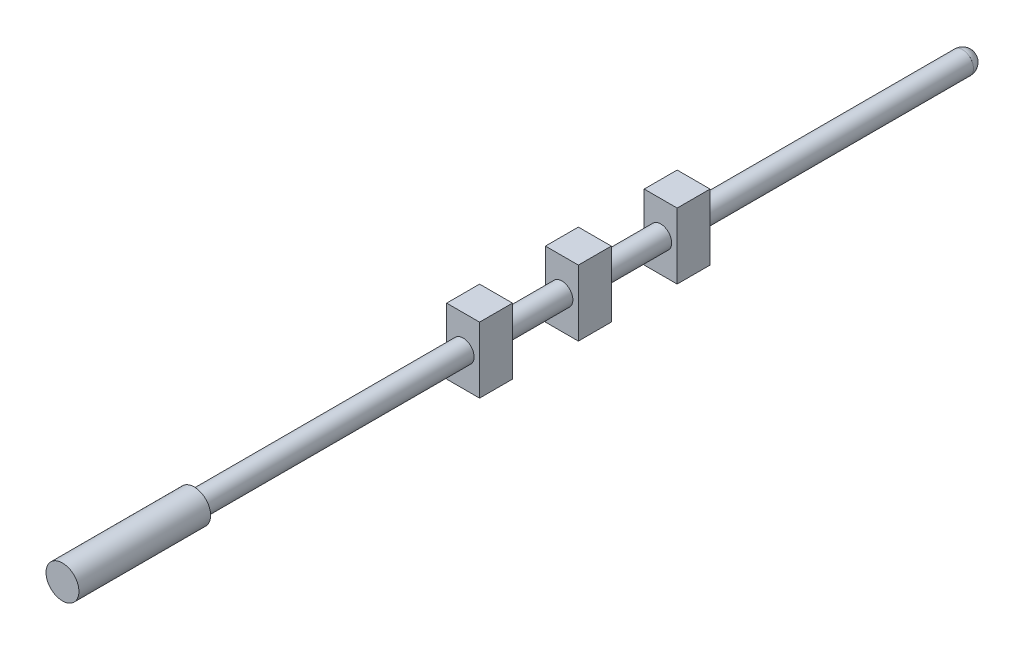
ISO-10303-21;
HEADER;
FILE_DESCRIPTION(('STEP AP214'),'2;1');
FILE_NAME('part.step','',(''),(''),'','','');
FILE_SCHEMA(('AUTOMOTIVE_DESIGN { 1 0 10303 214 1 1 1 1 }'));
ENDSEC;
DATA;
#1=APPLICATION_CONTEXT('core data for automotive mechanical design processes');
#2=APPLICATION_PROTOCOL_DEFINITION('international standard','automotive_design',2000,#1);
#3=PRODUCT_CONTEXT('',#1,'mechanical');
#4=PRODUCT('Part','Part','',(#3));
#5=PRODUCT_RELATED_PRODUCT_CATEGORY('part','',(#4));
#6=PRODUCT_DEFINITION_FORMATION('','',#4);
#7=PRODUCT_DEFINITION_CONTEXT('part definition',#1,'design');
#8=PRODUCT_DEFINITION('design','',#6,#7);
#9=PRODUCT_DEFINITION_SHAPE('','',#8);
#10=(LENGTH_UNIT() NAMED_UNIT(*) SI_UNIT(.MILLI.,.METRE.));
#11=(NAMED_UNIT(*) PLANE_ANGLE_UNIT() SI_UNIT($,.RADIAN.));
#12=(NAMED_UNIT(*) SI_UNIT($,.STERADIAN.) SOLID_ANGLE_UNIT());
#13=UNCERTAINTY_MEASURE_WITH_UNIT(LENGTH_MEASURE(1.E-05),#10,'distance_accuracy_value','');
#14=(GEOMETRIC_REPRESENTATION_CONTEXT(3) GLOBAL_UNCERTAINTY_ASSIGNED_CONTEXT((#13)) GLOBAL_UNIT_ASSIGNED_CONTEXT((#10,
#11,#12)) REPRESENTATION_CONTEXT('',''));
#15=CARTESIAN_POINT('',(0.,0.,0.));
#16=DIRECTION('',(0.,0.,1.));
#17=DIRECTION('',(1.,0.,0.));
#18=AXIS2_PLACEMENT_3D('',#15,#16,#17);
#19=CARTESIAN_POINT('',(0.,0.,0.));
#20=DIRECTION('',(0.,0.,-1.));
#21=DIRECTION('',(-1.,0.,0.));
#22=AXIS2_PLACEMENT_3D('',#19,#20,#21);
#23=PLANE('',#22);
#24=CARTESIAN_POINT('',(0.,0.,0.));
#25=DIRECTION('',(0.,0.,-1.));
#26=DIRECTION('',(-1.,0.,0.));
#27=AXIS2_PLACEMENT_3D('',#24,#25,#26);
#28=CIRCLE('',#27,25.4);
#29=CARTESIAN_POINT('',(-25.4,0.,0.));
#30=VERTEX_POINT('',#29);
#31=EDGE_CURVE('E11',#30,#30,#28,.T.);
#32=ORIENTED_EDGE('',*,*,#31,.F.);
#33=EDGE_LOOP('',(#32));
#34=FACE_BOUND('',#33,.T.);
#35=ADVANCED_FACE('F45',(#34),#23,.F.);
#36=CARTESIAN_POINT('',(0.,0.,0.));
#37=DIRECTION('',(0.,0.,-1.));
#38=DIRECTION('',(-1.,0.,0.));
#39=AXIS2_PLACEMENT_3D('',#36,#37,#38);
#40=SPHERICAL_SURFACE('',#39,25.4);
#41=ORIENTED_EDGE('',*,*,#31,.T.);
#42=EDGE_LOOP('',(#41));
#43=FACE_BOUND('',#42,.T.);
#44=ADVANCED_FACE('F47',(#43),#40,.T.);
#45=CLOSED_SHELL('',(#35,#44));
#46=MANIFOLD_SOLID_BREP('B2',#45);
#47=CARTESIAN_POINT('',(0.,0.,1778.));
#48=DIRECTION('',(0.,0.,-1.));
#49=DIRECTION('',(-1.,0.,0.));
#50=AXIS2_PLACEMENT_3D('',#47,#48,#49);
#51=CYLINDRICAL_SURFACE('',#50,25.4);
#52=CARTESIAN_POINT('',(0.,0.,850.9));
#53=DIRECTION('',(0.,0.,1.));
#54=DIRECTION('',(1.,0.,0.));
#55=AXIS2_PLACEMENT_3D('',#52,#53,#54);
#56=CIRCLE('',#55,25.4);
#57=CARTESIAN_POINT('',(25.4,0.,850.9));
#58=VERTEX_POINT('',#57);
#59=EDGE_CURVE('E272',#58,#58,#56,.T.);
#60=ORIENTED_EDGE('',*,*,#59,.F.);
#61=EDGE_LOOP('',(#60));
#62=FACE_BOUND('',#61,.T.);
#63=CARTESIAN_POINT('',(0.,0.,698.5));
#64=DIRECTION('',(0.,0.,-1.));
#65=DIRECTION('',(-1.,0.,0.));
#66=AXIS2_PLACEMENT_3D('',#63,#64,#65);
#67=CIRCLE('',#66,25.4);
#68=CARTESIAN_POINT('',(-25.4,0.,698.5));
#69=VERTEX_POINT('',#68);
#70=EDGE_CURVE('E43',#69,#69,#67,.T.);
#71=ORIENTED_EDGE('',*,*,#70,.F.);
#72=EDGE_LOOP('',(#71));
#73=FACE_BOUND('',#72,.T.);
#74=ADVANCED_FACE('F75',(#62,#73),#51,.T.);
#75=CARTESIAN_POINT('',(0.,0.,927.1));
#76=DIRECTION('',(0.,0.,-1.));
#77=DIRECTION('',(-1.,0.,0.));
#78=AXIS2_PLACEMENT_3D('',#75,#76,#77);
#79=CIRCLE('',#78,25.4);
#80=CARTESIAN_POINT('',(-25.4,0.,927.1));
#81=VERTEX_POINT('',#80);
#82=EDGE_CURVE('E277',#81,#81,#79,.T.);
#83=ORIENTED_EDGE('',*,*,#82,.F.);
#84=EDGE_LOOP('',(#83));
#85=FACE_BOUND('',#84,.T.);
#86=CARTESIAN_POINT('',(0.,0.,1079.5));
#87=DIRECTION('',(0.,0.,1.));
#88=DIRECTION('',(1.,0.,0.));
#89=AXIS2_PLACEMENT_3D('',#86,#87,#88);
#90=CIRCLE('',#89,25.4);
#91=CARTESIAN_POINT('',(25.4,0.,1079.5));
#92=VERTEX_POINT('',#91);
#93=EDGE_CURVE('E280',#92,#92,#90,.T.);
#94=ORIENTED_EDGE('',*,*,#93,.F.);
#95=EDGE_LOOP('',(#94));
#96=FACE_BOUND('',#95,.T.);
#97=ADVANCED_FACE('F293',(#85,#96),#51,.T.);
#98=CARTESIAN_POINT('',(-38.1,76.2,850.9));
#99=DIRECTION('',(1.,0.,0.));
#100=DIRECTION('',(0.,0.,-1.));
#101=AXIS2_PLACEMENT_3D('',#98,#99,#100);
#102=PLANE('',#101);
#103=DIRECTION('',(0.,0.,1.));
#104=VECTOR('',#103,1.);
#105=CARTESIAN_POINT('',(-38.1,-76.2,850.9));
#106=LINE('',#105,#104);
#107=CARTESIAN_POINT('',(-38.1,-76.2,850.9));
#108=VERTEX_POINT('',#107);
#109=CARTESIAN_POINT('',(-38.1,-76.2,927.1));
#110=VERTEX_POINT('',#109);
#111=EDGE_CURVE('E234',#108,#110,#106,.T.);
#112=ORIENTED_EDGE('',*,*,#111,.T.);
#113=DIRECTION('',(0.,-1.,0.));
#114=VECTOR('',#113,1.);
#115=CARTESIAN_POINT('',(-38.1,76.2,927.1));
#116=LINE('',#115,#114);
#117=CARTESIAN_POINT('',(-38.1,76.2,927.1));
#118=VERTEX_POINT('',#117);
#119=EDGE_CURVE('E260',#118,#110,#116,.T.);
#120=ORIENTED_EDGE('',*,*,#119,.F.);
#121=DIRECTION('',(0.,0.,1.));
#122=VECTOR('',#121,1.);
#123=CARTESIAN_POINT('',(-38.1,76.2,850.9));
#124=LINE('',#123,#122);
#125=CARTESIAN_POINT('',(-38.1,76.2,850.9));
#126=VERTEX_POINT('',#125);
#127=EDGE_CURVE('E242',#126,#118,#124,.T.);
#128=ORIENTED_EDGE('',*,*,#127,.F.);
#129=DIRECTION('',(0.,-1.,0.));
#130=VECTOR('',#129,1.);
#131=CARTESIAN_POINT('',(-38.1,76.2,850.9));
#132=LINE('',#131,#130);
#133=EDGE_CURVE('E248',#126,#108,#132,.T.);
#134=ORIENTED_EDGE('',*,*,#133,.T.);
#135=EDGE_LOOP('',(#112,#120,#128,#134));
#136=FACE_BOUND('',#135,.T.);
#137=ADVANCED_FACE('F299',(#136),#102,.F.);
#138=CARTESIAN_POINT('',(-38.1,76.2,927.1));
#139=DIRECTION('',(0.,0.,-1.));
#140=DIRECTION('',(-1.,0.,0.));
#141=AXIS2_PLACEMENT_3D('',#138,#139,#140);
#142=PLANE('',#141);
#143=ORIENTED_EDGE('',*,*,#82,.T.);
#144=EDGE_LOOP('',(#143));
#145=FACE_BOUND('',#144,.T.);
#146=DIRECTION('',(1.,0.,0.));
#147=VECTOR('',#146,1.);
#148=CARTESIAN_POINT('',(-38.1,-76.2,927.1));
#149=LINE('',#148,#147);
#150=CARTESIAN_POINT('',(38.1,-76.2,927.1));
#151=VERTEX_POINT('',#150);
#152=EDGE_CURVE('E251',#110,#151,#149,.T.);
#153=ORIENTED_EDGE('',*,*,#152,.T.);
#154=DIRECTION('',(0.,-1.,0.));
#155=VECTOR('',#154,1.);
#156=CARTESIAN_POINT('',(38.1,76.2,927.1));
#157=LINE('',#156,#155);
#158=CARTESIAN_POINT('',(38.1,76.2,927.1));
#159=VERTEX_POINT('',#158);
#160=EDGE_CURVE('E258',#159,#151,#157,.T.);
#161=ORIENTED_EDGE('',*,*,#160,.F.);
#162=DIRECTION('',(1.,0.,0.));
#163=VECTOR('',#162,1.);
#164=CARTESIAN_POINT('',(-38.1,76.2,927.1));
#165=LINE('',#164,#163);
#166=EDGE_CURVE('E124',#118,#159,#165,.T.);
#167=ORIENTED_EDGE('',*,*,#166,.F.);
#168=ORIENTED_EDGE('',*,*,#119,.T.);
#169=EDGE_LOOP('',(#153,#161,#167,#168));
#170=FACE_BOUND('',#169,.T.);
#171=ADVANCED_FACE('F372',(#145,#170),#142,.F.);
#172=CARTESIAN_POINT('',(38.1,76.2,850.9));
#173=DIRECTION('',(-1.,0.,0.));
#174=DIRECTION('',(0.,0.,1.));
#175=AXIS2_PLACEMENT_3D('',#172,#173,#174);
#176=PLANE('',#175);
#177=DIRECTION('',(0.,0.,-1.));
#178=VECTOR('',#177,1.);
#179=CARTESIAN_POINT('',(38.1,-76.2,850.9));
#180=LINE('',#179,#178);
#181=CARTESIAN_POINT('',(38.1,-76.2,850.9));
#182=VERTEX_POINT('',#181);
#183=EDGE_CURVE('E110',#151,#182,#180,.T.);
#184=ORIENTED_EDGE('',*,*,#183,.T.);
#185=DIRECTION('',(0.,-1.,0.));
#186=VECTOR('',#185,1.);
#187=CARTESIAN_POINT('',(38.1,76.2,850.9));
#188=LINE('',#187,#186);
#189=CARTESIAN_POINT('',(38.1,76.2,850.9));
#190=VERTEX_POINT('',#189);
#191=EDGE_CURVE('E256',#190,#182,#188,.T.);
#192=ORIENTED_EDGE('',*,*,#191,.F.);
#193=DIRECTION('',(0.,0.,-1.));
#194=VECTOR('',#193,1.);
#195=CARTESIAN_POINT('',(38.1,76.2,850.9));
#196=LINE('',#195,#194);
#197=EDGE_CURVE('E245',#159,#190,#196,.T.);
#198=ORIENTED_EDGE('',*,*,#197,.F.);
#199=ORIENTED_EDGE('',*,*,#160,.T.);
#200=EDGE_LOOP('',(#184,#192,#198,#199));
#201=FACE_BOUND('',#200,.T.);
#202=ADVANCED_FACE('F368',(#201),#176,.F.);
#203=CARTESIAN_POINT('',(-38.1,76.2,850.9));
#204=DIRECTION('',(0.,0.,1.));
#205=DIRECTION('',(1.,0.,0.));
#206=AXIS2_PLACEMENT_3D('',#203,#204,#205);
#207=PLANE('',#206);
#208=ORIENTED_EDGE('',*,*,#59,.T.);
#209=EDGE_LOOP('',(#208));
#210=FACE_BOUND('',#209,.T.);
#211=DIRECTION('',(-1.,0.,0.));
#212=VECTOR('',#211,1.);
#213=CARTESIAN_POINT('',(-38.1,-76.2,850.9));
#214=LINE('',#213,#212);
#215=EDGE_CURVE('E116',#182,#108,#214,.T.);
#216=ORIENTED_EDGE('',*,*,#215,.T.);
#217=ORIENTED_EDGE('',*,*,#133,.F.);
#218=DIRECTION('',(-1.,0.,0.));
#219=VECTOR('',#218,1.);
#220=CARTESIAN_POINT('',(-38.1,76.2,850.9));
#221=LINE('',#220,#219);
#222=EDGE_CURVE('E92',#190,#126,#221,.T.);
#223=ORIENTED_EDGE('',*,*,#222,.F.);
#224=ORIENTED_EDGE('',*,*,#191,.T.);
#225=EDGE_LOOP('',(#216,#217,#223,#224));
#226=FACE_BOUND('',#225,.T.);
#227=ADVANCED_FACE('F362',(#210,#226),#207,.F.);
#228=CARTESIAN_POINT('',(0.,76.2,0.));
#229=DIRECTION('',(0.,1.,0.));
#230=DIRECTION('',(0.,0.,1.));
#231=AXIS2_PLACEMENT_3D('',#228,#229,#230);
#232=PLANE('',#231);
#233=ORIENTED_EDGE('',*,*,#127,.T.);
#234=ORIENTED_EDGE('',*,*,#166,.T.);
#235=ORIENTED_EDGE('',*,*,#197,.T.);
#236=ORIENTED_EDGE('',*,*,#222,.T.);
#237=EDGE_LOOP('',(#233,#234,#235,#236));
#238=FACE_BOUND('',#237,.T.);
#239=ADVANCED_FACE('F358',(#238),#232,.T.);
#240=CARTESIAN_POINT('',(0.,-76.2,0.));
#241=DIRECTION('',(0.,1.,0.));
#242=DIRECTION('',(0.,0.,1.));
#243=AXIS2_PLACEMENT_3D('',#240,#241,#242);
#244=PLANE('',#243);
#245=ORIENTED_EDGE('',*,*,#111,.F.);
#246=ORIENTED_EDGE('',*,*,#215,.F.);
#247=ORIENTED_EDGE('',*,*,#183,.F.);
#248=ORIENTED_EDGE('',*,*,#152,.F.);
#249=EDGE_LOOP('',(#245,#246,#247,#248));
#250=FACE_BOUND('',#249,.T.);
#251=ADVANCED_FACE('F361',(#250),#244,.F.);
#252=CARTESIAN_POINT('',(-38.1,76.2,1079.5));
#253=DIRECTION('',(1.,0.,0.));
#254=DIRECTION('',(0.,0.,-1.));
#255=AXIS2_PLACEMENT_3D('',#252,#253,#254);
#256=PLANE('',#255);
#257=DIRECTION('',(0.,0.,1.));
#258=VECTOR('',#257,1.);
#259=CARTESIAN_POINT('',(-38.1,-76.2,1079.5));
#260=LINE('',#259,#258);
#261=CARTESIAN_POINT('',(-38.1,-76.2,1079.5));
#262=VERTEX_POINT('',#261);
#263=CARTESIAN_POINT('',(-38.1,-76.2,1155.7));
#264=VERTEX_POINT('',#263);
#265=EDGE_CURVE('E231',#262,#264,#260,.T.);
#266=ORIENTED_EDGE('',*,*,#265,.T.);
#267=DIRECTION('',(0.,-1.,0.));
#268=VECTOR('',#267,1.);
#269=CARTESIAN_POINT('',(-38.1,76.2,1155.7));
#270=LINE('',#269,#268);
#271=CARTESIAN_POINT('',(-38.1,76.2,1155.7));
#272=VERTEX_POINT('',#271);
#273=EDGE_CURVE('E201',#272,#264,#270,.T.);
#274=ORIENTED_EDGE('',*,*,#273,.F.);
#275=DIRECTION('',(0.,0.,1.));
#276=VECTOR('',#275,1.);
#277=CARTESIAN_POINT('',(-38.1,76.2,1079.5));
#278=LINE('',#277,#276);
#279=CARTESIAN_POINT('',(-38.1,76.2,1079.5));
#280=VERTEX_POINT('',#279);
#281=EDGE_CURVE('E227',#280,#272,#278,.T.);
#282=ORIENTED_EDGE('',*,*,#281,.F.);
#283=DIRECTION('',(0.,-1.,0.));
#284=VECTOR('',#283,1.);
#285=CARTESIAN_POINT('',(-38.1,76.2,1079.5));
#286=LINE('',#285,#284);
#287=EDGE_CURVE('E220',#280,#262,#286,.T.);
#288=ORIENTED_EDGE('',*,*,#287,.T.);
#289=EDGE_LOOP('',(#266,#274,#282,#288));
#290=FACE_BOUND('',#289,.T.);
#291=ADVANCED_FACE('F327',(#290),#256,.F.);
#292=CARTESIAN_POINT('',(-38.1,76.2,1155.7));
#293=DIRECTION('',(0.,0.,-1.));
#294=DIRECTION('',(-1.,0.,0.));
#295=AXIS2_PLACEMENT_3D('',#292,#293,#294);
#296=PLANE('',#295);
#297=CARTESIAN_POINT('',(0.,0.,1155.7));
#298=DIRECTION('',(0.,0.,-1.));
#299=DIRECTION('',(-1.,0.,0.));
#300=AXIS2_PLACEMENT_3D('',#297,#298,#299);
#301=CIRCLE('',#300,25.4);
#302=CARTESIAN_POINT('',(-25.4,0.,1155.7));
#303=VERTEX_POINT('',#302);
#304=EDGE_CURVE('E283',#303,#303,#301,.T.);
#305=ORIENTED_EDGE('',*,*,#304,.T.);
#306=EDGE_LOOP('',(#305));
#307=FACE_BOUND('',#306,.T.);
#308=DIRECTION('',(1.,0.,0.));
#309=VECTOR('',#308,1.);
#310=CARTESIAN_POINT('',(-38.1,-76.2,1155.7));
#311=LINE('',#310,#309);
#312=CARTESIAN_POINT('',(38.1,-76.2,1155.7));
#313=VERTEX_POINT('',#312);
#314=EDGE_CURVE('E229',#264,#313,#311,.T.);
#315=ORIENTED_EDGE('',*,*,#314,.T.);
#316=DIRECTION('',(0.,-1.,0.));
#317=VECTOR('',#316,1.);
#318=CARTESIAN_POINT('',(38.1,76.2,1155.7));
#319=LINE('',#318,#317);
#320=CARTESIAN_POINT('',(38.1,76.2,1155.7));
#321=VERTEX_POINT('',#320);
#322=EDGE_CURVE('E204',#321,#313,#319,.T.);
#323=ORIENTED_EDGE('',*,*,#322,.F.);
#324=DIRECTION('',(1.,0.,0.));
#325=VECTOR('',#324,1.);
#326=CARTESIAN_POINT('',(-38.1,76.2,1155.7));
#327=LINE('',#326,#325);
#328=EDGE_CURVE('E238',#272,#321,#327,.T.);
#329=ORIENTED_EDGE('',*,*,#328,.F.);
#330=ORIENTED_EDGE('',*,*,#273,.T.);
#331=EDGE_LOOP('',(#315,#323,#329,#330));
#332=FACE_BOUND('',#331,.T.);
#333=ADVANCED_FACE('F323',(#307,#332),#296,.F.);
#334=CARTESIAN_POINT('',(38.1,76.2,1079.5));
#335=DIRECTION('',(-1.,0.,0.));
#336=DIRECTION('',(0.,0.,1.));
#337=AXIS2_PLACEMENT_3D('',#334,#335,#336);
#338=PLANE('',#337);
#339=DIRECTION('',(0.,0.,-1.));
#340=VECTOR('',#339,1.);
#341=CARTESIAN_POINT('',(38.1,-76.2,1079.5));
#342=LINE('',#341,#340);
#343=CARTESIAN_POINT('',(38.1,-76.2,1079.5));
#344=VERTEX_POINT('',#343);
#345=EDGE_CURVE('E226',#313,#344,#342,.T.);
#346=ORIENTED_EDGE('',*,*,#345,.T.);
#347=DIRECTION('',(0.,-1.,0.));
#348=VECTOR('',#347,1.);
#349=CARTESIAN_POINT('',(38.1,76.2,1079.5));
#350=LINE('',#349,#348);
#351=CARTESIAN_POINT('',(38.1,76.2,1079.5));
#352=VERTEX_POINT('',#351);
#353=EDGE_CURVE('E217',#352,#344,#350,.T.);
#354=ORIENTED_EDGE('',*,*,#353,.F.);
#355=DIRECTION('',(0.,0.,-1.));
#356=VECTOR('',#355,1.);
#357=CARTESIAN_POINT('',(38.1,76.2,1079.5));
#358=LINE('',#357,#356);
#359=EDGE_CURVE('E236',#321,#352,#358,.T.);
#360=ORIENTED_EDGE('',*,*,#359,.F.);
#361=ORIENTED_EDGE('',*,*,#322,.T.);
#362=EDGE_LOOP('',(#346,#354,#360,#361));
#363=FACE_BOUND('',#362,.T.);
#364=ADVANCED_FACE('F326',(#363),#338,.F.);
#365=CARTESIAN_POINT('',(-38.1,76.2,1079.5));
#366=DIRECTION('',(0.,0.,1.));
#367=DIRECTION('',(1.,0.,0.));
#368=AXIS2_PLACEMENT_3D('',#365,#366,#367);
#369=PLANE('',#368);
#370=ORIENTED_EDGE('',*,*,#93,.T.);
#371=EDGE_LOOP('',(#370));
#372=FACE_BOUND('',#371,.T.);
#373=DIRECTION('',(-1.,0.,0.));
#374=VECTOR('',#373,1.);
#375=CARTESIAN_POINT('',(-38.1,-76.2,1079.5));
#376=LINE('',#375,#374);
#377=EDGE_CURVE('E224',#344,#262,#376,.T.);
#378=ORIENTED_EDGE('',*,*,#377,.T.);
#379=ORIENTED_EDGE('',*,*,#287,.F.);
#380=DIRECTION('',(-1.,0.,0.));
#381=VECTOR('',#380,1.);
#382=CARTESIAN_POINT('',(-38.1,76.2,1079.5));
#383=LINE('',#382,#381);
#384=EDGE_CURVE('E223',#352,#280,#383,.T.);
#385=ORIENTED_EDGE('',*,*,#384,.F.);
#386=ORIENTED_EDGE('',*,*,#353,.T.);
#387=EDGE_LOOP('',(#378,#379,#385,#386));
#388=FACE_BOUND('',#387,.T.);
#389=ADVANCED_FACE('F341',(#372,#388),#369,.F.);
#390=CARTESIAN_POINT('',(0.,76.2,0.));
#391=DIRECTION('',(0.,1.,0.));
#392=DIRECTION('',(0.,0.,1.));
#393=AXIS2_PLACEMENT_3D('',#390,#391,#392);
#394=PLANE('',#393);
#395=ORIENTED_EDGE('',*,*,#281,.T.);
#396=ORIENTED_EDGE('',*,*,#328,.T.);
#397=ORIENTED_EDGE('',*,*,#359,.T.);
#398=ORIENTED_EDGE('',*,*,#384,.T.);
#399=EDGE_LOOP('',(#395,#396,#397,#398));
#400=FACE_BOUND('',#399,.T.);
#401=ADVANCED_FACE('F346',(#400),#394,.T.);
#402=CARTESIAN_POINT('',(0.,-76.2,0.));
#403=DIRECTION('',(0.,1.,0.));
#404=DIRECTION('',(0.,0.,1.));
#405=AXIS2_PLACEMENT_3D('',#402,#403,#404);
#406=PLANE('',#405);
#407=ORIENTED_EDGE('',*,*,#265,.F.);
#408=ORIENTED_EDGE('',*,*,#377,.F.);
#409=ORIENTED_EDGE('',*,*,#345,.F.);
#410=ORIENTED_EDGE('',*,*,#314,.F.);
#411=EDGE_LOOP('',(#407,#408,#409,#410));
#412=FACE_BOUND('',#411,.T.);
#413=ADVANCED_FACE('F338',(#412),#406,.F.);
#414=CARTESIAN_POINT('',(0.,0.,2082.8));
#415=DIRECTION('',(0.,0.,1.));
#416=DIRECTION('',(1.,0.,0.));
#417=AXIS2_PLACEMENT_3D('',#414,#415,#416);
#418=PLANE('',#417);
#419=CARTESIAN_POINT('',(0.,0.,2082.8));
#420=DIRECTION('',(0.,0.,1.));
#421=DIRECTION('',(1.,0.,0.));
#422=AXIS2_PLACEMENT_3D('',#419,#420,#421);
#423=CIRCLE('',#422,38.1);
#424=CARTESIAN_POINT('',(-38.1,0.,2082.8));
#425=VERTEX_POINT('',#424);
#426=EDGE_CURVE('E263',#425,#425,#423,.T.);
#427=ORIENTED_EDGE('',*,*,#426,.T.);
#428=EDGE_LOOP('',(#427));
#429=FACE_BOUND('',#428,.T.);
#430=ADVANCED_FACE('F353',(#429),#418,.T.);
#431=CARTESIAN_POINT('',(0.,0.,2082.8));
#432=DIRECTION('',(0.,0.,-1.));
#433=DIRECTION('',(-1.,0.,0.));
#434=AXIS2_PLACEMENT_3D('',#431,#432,#433);
#435=CYLINDRICAL_SURFACE('',#434,38.1);
#436=CARTESIAN_POINT('',(0.,0.,1778.));
#437=DIRECTION('',(0.,0.,1.));
#438=DIRECTION('',(1.,0.,0.));
#439=AXIS2_PLACEMENT_3D('',#436,#437,#438);
#440=CIRCLE('',#439,38.1);
#441=CARTESIAN_POINT('',(-38.1,0.,1778.));
#442=VERTEX_POINT('',#441);
#443=EDGE_CURVE('E262',#442,#442,#440,.T.);
#444=CARTESIAN_POINT('',(-38.1,0.,2082.8));
#445=CARTESIAN_POINT('',(-38.1,0.,2079.625));
#446=CARTESIAN_POINT('',(-38.1,0.,2076.45));
#447=CARTESIAN_POINT('',(-38.1,0.,2070.1));
#448=CARTESIAN_POINT('',(-38.1,0.,2066.925));
#449=CARTESIAN_POINT('',(-38.1,0.,2060.575));
#450=CARTESIAN_POINT('',(-38.1,0.,2057.4));
#451=CARTESIAN_POINT('',(-38.1,0.,2051.05));
#452=CARTESIAN_POINT('',(-38.1,0.,2047.875));
#453=CARTESIAN_POINT('',(-38.1,0.,2041.525));
#454=CARTESIAN_POINT('',(-38.1,0.,2038.35));
#455=CARTESIAN_POINT('',(-38.1,0.,2032.));
#456=CARTESIAN_POINT('',(-38.1,0.,2028.825));
#457=CARTESIAN_POINT('',(-38.1,0.,2022.475));
#458=CARTESIAN_POINT('',(-38.1,0.,2019.3));
#459=CARTESIAN_POINT('',(-38.1,0.,2012.95));
#460=CARTESIAN_POINT('',(-38.1,0.,2009.775));
#461=CARTESIAN_POINT('',(-38.1,0.,2003.425));
#462=CARTESIAN_POINT('',(-38.1,0.,2000.25));
#463=CARTESIAN_POINT('',(-38.1,0.,1993.9));
#464=CARTESIAN_POINT('',(-38.1,0.,1990.725));
#465=CARTESIAN_POINT('',(-38.1,0.,1984.375));
#466=CARTESIAN_POINT('',(-38.1,0.,1981.2));
#467=CARTESIAN_POINT('',(-38.1,0.,1974.85));
#468=CARTESIAN_POINT('',(-38.1,0.,1971.675));
#469=CARTESIAN_POINT('',(-38.1,0.,1965.325));
#470=CARTESIAN_POINT('',(-38.1,0.,1962.15));
#471=CARTESIAN_POINT('',(-38.1,0.,1955.8));
#472=CARTESIAN_POINT('',(-38.1,0.,1952.625));
#473=CARTESIAN_POINT('',(-38.1,0.,1946.275));
#474=CARTESIAN_POINT('',(-38.1,0.,1943.1));
#475=CARTESIAN_POINT('',(-38.1,0.,1936.75));
#476=CARTESIAN_POINT('',(-38.1,0.,1933.575));
#477=CARTESIAN_POINT('',(-38.1,0.,1927.225));
#478=CARTESIAN_POINT('',(-38.1,0.,1924.05));
#479=CARTESIAN_POINT('',(-38.1,0.,1917.7));
#480=CARTESIAN_POINT('',(-38.1,0.,1914.525));
#481=CARTESIAN_POINT('',(-38.1,0.,1908.175));
#482=CARTESIAN_POINT('',(-38.1,0.,1905.));
#483=CARTESIAN_POINT('',(-38.1,0.,1898.65));
#484=CARTESIAN_POINT('',(-38.1,0.,1895.475));
#485=CARTESIAN_POINT('',(-38.1,0.,1889.125));
#486=CARTESIAN_POINT('',(-38.1,0.,1885.95));
#487=CARTESIAN_POINT('',(-38.1,0.,1879.6));
#488=CARTESIAN_POINT('',(-38.1,0.,1876.425));
#489=CARTESIAN_POINT('',(-38.1,0.,1870.075));
#490=CARTESIAN_POINT('',(-38.1,0.,1866.9));
#491=CARTESIAN_POINT('',(-38.1,0.,1860.55));
#492=CARTESIAN_POINT('',(-38.1,0.,1857.375));
#493=CARTESIAN_POINT('',(-38.1,0.,1851.025));
#494=CARTESIAN_POINT('',(-38.1,0.,1847.85));
#495=CARTESIAN_POINT('',(-38.1,0.,1841.5));
#496=CARTESIAN_POINT('',(-38.1,0.,1838.325));
#497=CARTESIAN_POINT('',(-38.1,0.,1831.975));
#498=CARTESIAN_POINT('',(-38.1,0.,1828.8));
#499=CARTESIAN_POINT('',(-38.1,0.,1822.45));
#500=CARTESIAN_POINT('',(-38.1,0.,1819.275));
#501=CARTESIAN_POINT('',(-38.1,0.,1812.925));
#502=CARTESIAN_POINT('',(-38.1,0.,1809.75));
#503=CARTESIAN_POINT('',(-38.1,0.,1803.4));
#504=CARTESIAN_POINT('',(-38.1,0.,1800.225));
#505=CARTESIAN_POINT('',(-38.1,0.,1793.875));
#506=CARTESIAN_POINT('',(-38.1,0.,1790.7));
#507=CARTESIAN_POINT('',(-38.1,0.,1784.35));
#508=CARTESIAN_POINT('',(-38.1,0.,1781.175));
#509=CARTESIAN_POINT('',(-38.1,0.,1778.));
#510=B_SPLINE_CURVE_WITH_KNOTS('',3,(#444,#445,#446,#447,#448,#449,#450,#451,#452,#453,#454,
#455,#456,#457,#458,#459,#460,#461,#462,#463,#464,#465,#466,#467,#468,#469,#470,#471,#472,#473,
#474,#475,#476,#477,#478,#479,#480,#481,#482,#483,#484,#485,#486,#487,#488,#489,#490,#491,#492,
#493,#494,#495,#496,#497,#498,#499,#500,#501,#502,#503,#504,#505,#506,#507,#508,#509),
.UNSPECIFIED.,.F.,.F.,(4,2,2,2,2,2,2,2,2,2,2,2,2,2,2,2,2,2,2,2,2,2,2,2,2,2,2,2,2,2,2,2,4),(0.,
9.52500000000001,19.05,28.575,38.1,47.625,57.15,66.675,76.2,85.7250000000003,95.2500000000003,
104.775,114.3,123.825,133.35,142.875,152.4,161.925,171.45,180.975,190.5,200.025,209.55,219.075,
228.6,238.125,247.65,257.175,266.7,276.225,285.75,295.275,304.8),.UNSPECIFIED.);
#511=EDGE_CURVE('BSEAM316',#425,#442,#510,.T.);
#512=ORIENTED_EDGE('',*,*,#426,.F.);
#513=ORIENTED_EDGE('',*,*,#443,.T.);
#514=ORIENTED_EDGE('',*,*,#511,.T.);
#515=ORIENTED_EDGE('',*,*,#511,.F.);
#516=EDGE_LOOP('',(#512,#514,#513,#515));
#517=FACE_BOUND('',#516,.T.);
#518=ADVANCED_FACE('F316',(#517),#435,.T.);
#519=CARTESIAN_POINT('',(0.,0.,1778.));
#520=DIRECTION('',(0.,0.,1.));
#521=DIRECTION('',(1.,0.,0.));
#522=AXIS2_PLACEMENT_3D('',#519,#520,#521);
#523=PLANE('',#522);
#524=CARTESIAN_POINT('',(0.,0.,1778.));
#525=DIRECTION('',(0.,0.,1.));
#526=DIRECTION('',(1.,0.,0.));
#527=AXIS2_PLACEMENT_3D('',#524,#525,#526);
#528=CIRCLE('',#527,25.4);
#529=CARTESIAN_POINT('',(25.4,0.,1778.));
#530=VERTEX_POINT('',#529);
#531=EDGE_CURVE('E269',#530,#530,#528,.T.);
#532=ORIENTED_EDGE('',*,*,#531,.T.);
#533=EDGE_LOOP('',(#532));
#534=FACE_BOUND('',#533,.T.);
#535=ORIENTED_EDGE('',*,*,#443,.F.);
#536=EDGE_LOOP('',(#535));
#537=FACE_BOUND('',#536,.T.);
#538=ADVANCED_FACE('F308',(#534,#537),#523,.F.);
#539=ORIENTED_EDGE('',*,*,#531,.F.);
#540=EDGE_LOOP('',(#539));
#541=FACE_BOUND('',#540,.T.);
#542=ORIENTED_EDGE('',*,*,#304,.F.);
#543=EDGE_LOOP('',(#542));
#544=FACE_BOUND('',#543,.T.);
#545=ADVANCED_FACE('F77',(#541,#544),#51,.T.);
#546=CARTESIAN_POINT('',(-38.1,76.2,622.3));
#547=DIRECTION('',(1.,0.,0.));
#548=DIRECTION('',(0.,0.,-1.));
#549=AXIS2_PLACEMENT_3D('',#546,#547,#548);
#550=PLANE('',#549);
#551=DIRECTION('',(0.,0.,1.));
#552=VECTOR('',#551,1.);
#553=CARTESIAN_POINT('',(-38.1,-76.2,622.3));
#554=LINE('',#553,#552);
#555=CARTESIAN_POINT('',(-38.1,-76.2,622.3));
#556=VERTEX_POINT('',#555);
#557=CARTESIAN_POINT('',(-38.1,-76.2,698.5));
#558=VERTEX_POINT('',#557);
#559=EDGE_CURVE('E194',#556,#558,#554,.T.);
#560=ORIENTED_EDGE('',*,*,#559,.T.);
#561=DIRECTION('',(0.,-1.,0.));
#562=VECTOR('',#561,1.);
#563=CARTESIAN_POINT('',(-38.1,76.2,698.5));
#564=LINE('',#563,#562);
#565=CARTESIAN_POINT('',(-38.1,76.2,698.5));
#566=VERTEX_POINT('',#565);
#567=EDGE_CURVE('E608',#566,#558,#564,.T.);
#568=ORIENTED_EDGE('',*,*,#567,.F.);
#569=DIRECTION('',(0.,0.,1.));
#570=VECTOR('',#569,1.);
#571=CARTESIAN_POINT('',(-38.1,76.2,622.3));
#572=LINE('',#571,#570);
#573=CARTESIAN_POINT('',(-38.1,76.2,622.3));
#574=VERTEX_POINT('',#573);
#575=EDGE_CURVE('E188',#574,#566,#572,.T.);
#576=ORIENTED_EDGE('',*,*,#575,.F.);
#577=DIRECTION('',(0.,-1.,0.));
#578=VECTOR('',#577,1.);
#579=CARTESIAN_POINT('',(-38.1,76.2,622.3));
#580=LINE('',#579,#578);
#581=EDGE_CURVE('E180',#574,#556,#580,.T.);
#582=ORIENTED_EDGE('',*,*,#581,.T.);
#583=EDGE_LOOP('',(#560,#568,#576,#582));
#584=FACE_BOUND('',#583,.T.);
#585=ADVANCED_FACE('F192',(#584),#550,.F.);
#586=CARTESIAN_POINT('',(-38.1,76.2,698.5));
#587=DIRECTION('',(0.,0.,-1.));
#588=DIRECTION('',(-1.,0.,0.));
#589=AXIS2_PLACEMENT_3D('',#586,#587,#588);
#590=PLANE('',#589);
#591=ORIENTED_EDGE('',*,*,#70,.T.);
#592=EDGE_LOOP('',(#591));
#593=FACE_BOUND('',#592,.T.);
#594=DIRECTION('',(1.,0.,0.));
#595=VECTOR('',#594,1.);
#596=CARTESIAN_POINT('',(-38.1,-76.2,698.5));
#597=LINE('',#596,#595);
#598=CARTESIAN_POINT('',(38.1,-76.2,698.5));
#599=VERTEX_POINT('',#598);
#600=EDGE_CURVE('E199',#558,#599,#597,.T.);
#601=ORIENTED_EDGE('',*,*,#600,.T.);
#602=DIRECTION('',(0.,-1.,0.));
#603=VECTOR('',#602,1.);
#604=CARTESIAN_POINT('',(38.1,76.2,698.5));
#605=LINE('',#604,#603);
#606=CARTESIAN_POINT('',(38.1,76.2,698.5));
#607=VERTEX_POINT('',#606);
#608=EDGE_CURVE('E610',#607,#599,#605,.T.);
#609=ORIENTED_EDGE('',*,*,#608,.F.);
#610=DIRECTION('',(1.,0.,0.));
#611=VECTOR('',#610,1.);
#612=CARTESIAN_POINT('',(-38.1,76.2,698.5));
#613=LINE('',#612,#611);
#614=EDGE_CURVE('E212',#566,#607,#613,.T.);
#615=ORIENTED_EDGE('',*,*,#614,.F.);
#616=ORIENTED_EDGE('',*,*,#567,.T.);
#617=EDGE_LOOP('',(#601,#609,#615,#616));
#618=FACE_BOUND('',#617,.T.);
#619=ADVANCED_FACE('F314',(#593,#618),#590,.F.);
#620=CARTESIAN_POINT('',(38.1,76.2,622.3));
#621=DIRECTION('',(-1.,0.,0.));
#622=DIRECTION('',(0.,0.,1.));
#623=AXIS2_PLACEMENT_3D('',#620,#621,#622);
#624=PLANE('',#623);
#625=DIRECTION('',(0.,0.,-1.));
#626=VECTOR('',#625,1.);
#627=CARTESIAN_POINT('',(38.1,-76.2,622.3));
#628=LINE('',#627,#626);
#629=CARTESIAN_POINT('',(38.1,-76.2,622.3));
#630=VERTEX_POINT('',#629);
#631=EDGE_CURVE('E187',#599,#630,#628,.T.);
#632=ORIENTED_EDGE('',*,*,#631,.T.);
#633=DIRECTION('',(0.,-1.,0.));
#634=VECTOR('',#633,1.);
#635=CARTESIAN_POINT('',(38.1,76.2,622.3));
#636=LINE('',#635,#634);
#637=CARTESIAN_POINT('',(38.1,76.2,622.3));
#638=VERTEX_POINT('',#637);
#639=EDGE_CURVE('E183',#638,#630,#636,.T.);
#640=ORIENTED_EDGE('',*,*,#639,.F.);
#641=DIRECTION('',(0.,0.,-1.));
#642=VECTOR('',#641,1.);
#643=CARTESIAN_POINT('',(38.1,76.2,622.3));
#644=LINE('',#643,#642);
#645=EDGE_CURVE('E210',#607,#638,#644,.T.);
#646=ORIENTED_EDGE('',*,*,#645,.F.);
#647=ORIENTED_EDGE('',*,*,#608,.T.);
#648=EDGE_LOOP('',(#632,#640,#646,#647));
#649=FACE_BOUND('',#648,.T.);
#650=ADVANCED_FACE('F520',(#649),#624,.F.);
#651=CARTESIAN_POINT('',(-38.1,76.2,622.3));
#652=DIRECTION('',(0.,0.,1.));
#653=DIRECTION('',(1.,0.,0.));
#654=AXIS2_PLACEMENT_3D('',#651,#652,#653);
#655=PLANE('',#654);
#656=CARTESIAN_POINT('',(0.,0.,622.3));
#657=DIRECTION('',(0.,0.,1.));
#658=DIRECTION('',(1.,0.,0.));
#659=AXIS2_PLACEMENT_3D('',#656,#657,#658);
#660=CIRCLE('',#659,25.4);
#661=CARTESIAN_POINT('',(25.4,0.,622.3));
#662=VERTEX_POINT('',#661);
#663=EDGE_CURVE('E84',#662,#662,#660,.T.);
#664=ORIENTED_EDGE('',*,*,#663,.T.);
#665=EDGE_LOOP('',(#664));
#666=FACE_BOUND('',#665,.T.);
#667=DIRECTION('',(-1.,0.,0.));
#668=VECTOR('',#667,1.);
#669=CARTESIAN_POINT('',(-38.1,-76.2,622.3));
#670=LINE('',#669,#668);
#671=EDGE_CURVE('E176',#630,#556,#670,.T.);
#672=ORIENTED_EDGE('',*,*,#671,.T.);
#673=ORIENTED_EDGE('',*,*,#581,.F.);
#674=DIRECTION('',(-1.,0.,0.));
#675=VECTOR('',#674,1.);
#676=CARTESIAN_POINT('',(-38.1,76.2,622.3));
#677=LINE('',#676,#675);
#678=EDGE_CURVE('E196',#638,#574,#677,.T.);
#679=ORIENTED_EDGE('',*,*,#678,.F.);
#680=ORIENTED_EDGE('',*,*,#639,.T.);
#681=EDGE_LOOP('',(#672,#673,#679,#680));
#682=FACE_BOUND('',#681,.T.);
#683=ADVANCED_FACE('F178',(#666,#682),#655,.F.);
#684=CARTESIAN_POINT('',(0.,76.2,0.));
#685=DIRECTION('',(0.,1.,0.));
#686=DIRECTION('',(0.,0.,1.));
#687=AXIS2_PLACEMENT_3D('',#684,#685,#686);
#688=PLANE('',#687);
#689=ORIENTED_EDGE('',*,*,#575,.T.);
#690=ORIENTED_EDGE('',*,*,#614,.T.);
#691=ORIENTED_EDGE('',*,*,#645,.T.);
#692=ORIENTED_EDGE('',*,*,#678,.T.);
#693=EDGE_LOOP('',(#689,#690,#691,#692));
#694=FACE_BOUND('',#693,.T.);
#695=ADVANCED_FACE('F541',(#694),#688,.T.);
#696=CARTESIAN_POINT('',(0.,-76.2,0.));
#697=DIRECTION('',(0.,1.,0.));
#698=DIRECTION('',(0.,0.,1.));
#699=AXIS2_PLACEMENT_3D('',#696,#697,#698);
#700=PLANE('',#699);
#701=ORIENTED_EDGE('',*,*,#559,.F.);
#702=ORIENTED_EDGE('',*,*,#671,.F.);
#703=ORIENTED_EDGE('',*,*,#631,.F.);
#704=ORIENTED_EDGE('',*,*,#600,.F.);
#705=EDGE_LOOP('',(#701,#702,#703,#704));
#706=FACE_BOUND('',#705,.T.);
#707=ADVANCED_FACE('F198',(#706),#700,.F.);
#708=CARTESIAN_POINT('',(0.,0.,0.));
#709=DIRECTION('',(0.,0.,1.));
#710=DIRECTION('',(1.,0.,0.));
#711=AXIS2_PLACEMENT_3D('',#708,#709,#710);
#712=PLANE('',#711);
#713=CARTESIAN_POINT('',(0.,0.,0.));
#714=DIRECTION('',(0.,0.,1.));
#715=DIRECTION('',(1.,0.,0.));
#716=AXIS2_PLACEMENT_3D('',#713,#714,#715);
#717=CIRCLE('',#716,25.4);
#718=CARTESIAN_POINT('',(25.4,0.,0.));
#719=VERTEX_POINT('',#718);
#720=EDGE_CURVE('E266',#719,#719,#717,.T.);
#721=ORIENTED_EDGE('',*,*,#720,.F.);
#722=EDGE_LOOP('',(#721));
#723=FACE_BOUND('',#722,.T.);
#724=ADVANCED_FACE('F291',(#723),#712,.F.);
#725=ORIENTED_EDGE('',*,*,#720,.T.);
#726=EDGE_LOOP('',(#725));
#727=FACE_BOUND('',#726,.T.);
#728=ORIENTED_EDGE('',*,*,#663,.F.);
#729=EDGE_LOOP('',(#728));
#730=FACE_BOUND('',#729,.T.);
#731=ADVANCED_FACE('F289',(#727,#730),#51,.T.);
#732=CLOSED_SHELL('',(#74,#97,#137,#171,#202,#227,#239,#251,#291,#333,#364,#389,#401,#413,#430,
#518,#538,#545,#585,#619,#650,#683,#695,#707,#724,#731));
#733=MANIFOLD_SOLID_BREP('B6',#732);
#734=ADVANCED_BREP_SHAPE_REPRESENTATION('',(#18,#46,#733),#14);
#735=SHAPE_DEFINITION_REPRESENTATION(#9,#734);
ENDSEC;
END-ISO-10303-21;
